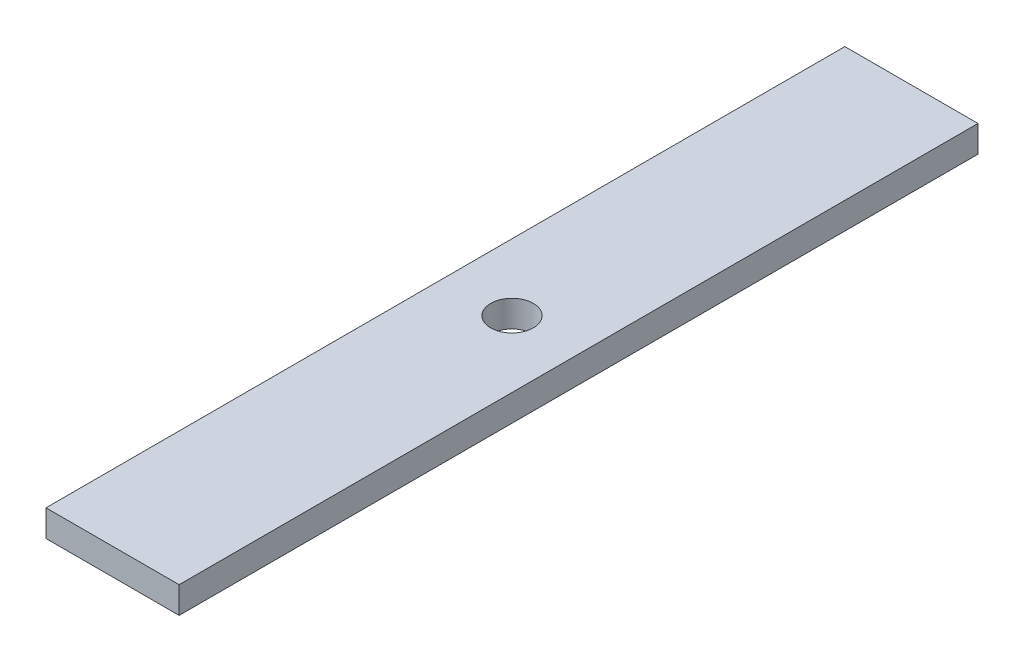
ISO-10303-21;
HEADER;
FILE_DESCRIPTION(('STEP AP214'),'2;1');
FILE_NAME('part.step','',(''),(''),'','','');
FILE_SCHEMA(('AUTOMOTIVE_DESIGN { 1 0 10303 214 1 1 1 1 }'));
ENDSEC;
DATA;
#1=APPLICATION_CONTEXT('core data for automotive mechanical design processes');
#2=APPLICATION_PROTOCOL_DEFINITION('international standard','automotive_design',2000,#1);
#3=PRODUCT_CONTEXT('',#1,'mechanical');
#4=PRODUCT('Part','Part','',(#3));
#5=PRODUCT_RELATED_PRODUCT_CATEGORY('part','',(#4));
#6=PRODUCT_DEFINITION_FORMATION('','',#4);
#7=PRODUCT_DEFINITION_CONTEXT('part definition',#1,'design');
#8=PRODUCT_DEFINITION('design','',#6,#7);
#9=PRODUCT_DEFINITION_SHAPE('','',#8);
#10=(LENGTH_UNIT() NAMED_UNIT(*) SI_UNIT(.MILLI.,.METRE.));
#11=(NAMED_UNIT(*) PLANE_ANGLE_UNIT() SI_UNIT($,.RADIAN.));
#12=(NAMED_UNIT(*) SI_UNIT($,.STERADIAN.) SOLID_ANGLE_UNIT());
#13=UNCERTAINTY_MEASURE_WITH_UNIT(LENGTH_MEASURE(1.E-05),#10,'distance_accuracy_value','');
#14=(GEOMETRIC_REPRESENTATION_CONTEXT(3) GLOBAL_UNCERTAINTY_ASSIGNED_CONTEXT((#13)) GLOBAL_UNIT_ASSIGNED_CONTEXT((#10,
#11,#12)) REPRESENTATION_CONTEXT('',''));
#15=CARTESIAN_POINT('',(0.,0.,0.));
#16=DIRECTION('',(0.,0.,1.));
#17=DIRECTION('',(1.,0.,0.));
#18=AXIS2_PLACEMENT_3D('',#15,#16,#17);
#19=CARTESIAN_POINT('',(-12.5,2.5,106.));
#20=DIRECTION('',(1.,0.,0.));
#21=DIRECTION('',(0.,0.,-1.));
#22=AXIS2_PLACEMENT_3D('',#19,#20,#21);
#23=PLANE('',#22);
#24=DIRECTION('',(0.,-1.,0.));
#25=VECTOR('',#24,1.);
#26=CARTESIAN_POINT('',(-12.5,2.5,75.));
#27=LINE('',#26,#25);
#28=CARTESIAN_POINT('',(-12.5,2.5,75.));
#29=VERTEX_POINT('',#28);
#30=CARTESIAN_POINT('',(-12.5,-2.5,75.));
#31=VERTEX_POINT('',#30);
#32=EDGE_CURVE('E74',#29,#31,#27,.T.);
#33=ORIENTED_EDGE('',*,*,#32,.F.);
#34=DIRECTION('',(0.,0.,-1.));
#35=VECTOR('',#34,1.);
#36=CARTESIAN_POINT('',(-12.5,2.5,106.));
#37=LINE('',#36,#35);
#38=CARTESIAN_POINT('',(-12.5,2.5,-75.));
#39=VERTEX_POINT('',#38);
#40=EDGE_CURVE('E86',#29,#39,#37,.T.);
#41=ORIENTED_EDGE('',*,*,#40,.T.);
#42=DIRECTION('',(0.,1.,0.));
#43=VECTOR('',#42,1.);
#44=CARTESIAN_POINT('',(-12.5,2.5,-75.));
#45=LINE('',#44,#43);
#46=CARTESIAN_POINT('',(-12.5,-2.5,-75.));
#47=VERTEX_POINT('',#46);
#48=EDGE_CURVE('E56',#47,#39,#45,.T.);
#49=ORIENTED_EDGE('',*,*,#48,.F.);
#50=DIRECTION('',(0.,0.,-1.));
#51=VECTOR('',#50,1.);
#52=CARTESIAN_POINT('',(-12.5,-2.5,106.));
#53=LINE('',#52,#51);
#54=EDGE_CURVE('E12',#31,#47,#53,.T.);
#55=ORIENTED_EDGE('',*,*,#54,.F.);
#56=EDGE_LOOP('',(#33,#41,#49,#55));
#57=FACE_BOUND('',#56,.T.);
#58=ADVANCED_FACE('F34',(#57),#23,.F.);
#59=CARTESIAN_POINT('',(-12.5,-2.5,106.));
#60=DIRECTION('',(0.,1.,0.));
#61=DIRECTION('',(-1.,0.,0.));
#62=AXIS2_PLACEMENT_3D('',#59,#60,#61);
#63=PLANE('',#62);
#64=CARTESIAN_POINT('',(0.,-2.5,0.));
#65=DIRECTION('',(0.,1.,0.));
#66=DIRECTION('',(-1.,0.,0.));
#67=AXIS2_PLACEMENT_3D('',#64,#65,#66);
#68=CIRCLE('',#67,4.);
#69=CARTESIAN_POINT('',(-4.,-2.5,0.));
#70=VERTEX_POINT('',#69);
#71=EDGE_CURVE('E91',#70,#70,#68,.T.);
#72=ORIENTED_EDGE('',*,*,#71,.T.);
#73=EDGE_LOOP('',(#72));
#74=FACE_BOUND('',#73,.T.);
#75=DIRECTION('',(1.,0.,0.));
#76=VECTOR('',#75,1.);
#77=CARTESIAN_POINT('',(-25.7525042215434,-2.5,75.));
#78=LINE('',#77,#76);
#79=CARTESIAN_POINT('',(12.5,-2.5,75.));
#80=VERTEX_POINT('',#79);
#81=EDGE_CURVE('E106',#31,#80,#78,.T.);
#82=ORIENTED_EDGE('',*,*,#81,.F.);
#83=ORIENTED_EDGE('',*,*,#54,.T.);
#84=DIRECTION('',(-1.,0.,0.));
#85=VECTOR('',#84,1.);
#86=CARTESIAN_POINT('',(-25.7525042215434,-2.5,-75.));
#87=LINE('',#86,#85);
#88=CARTESIAN_POINT('',(12.5,-2.5,-75.));
#89=VERTEX_POINT('',#88);
#90=EDGE_CURVE('E80',#89,#47,#87,.T.);
#91=ORIENTED_EDGE('',*,*,#90,.F.);
#92=DIRECTION('',(0.,0.,-1.));
#93=VECTOR('',#92,1.);
#94=CARTESIAN_POINT('',(12.5,-2.5,106.));
#95=LINE('',#94,#93);
#96=EDGE_CURVE('E41',#80,#89,#95,.T.);
#97=ORIENTED_EDGE('',*,*,#96,.F.);
#98=EDGE_LOOP('',(#82,#83,#91,#97));
#99=FACE_BOUND('',#98,.T.);
#100=ADVANCED_FACE('F105',(#74,#99),#63,.F.);
#101=CARTESIAN_POINT('',(12.5,2.5,106.));
#102=DIRECTION('',(-1.,0.,0.));
#103=DIRECTION('',(0.,0.,1.));
#104=AXIS2_PLACEMENT_3D('',#101,#102,#103);
#105=PLANE('',#104);
#106=DIRECTION('',(0.,1.,0.));
#107=VECTOR('',#106,1.);
#108=CARTESIAN_POINT('',(12.5,2.5,75.));
#109=LINE('',#108,#107);
#110=CARTESIAN_POINT('',(12.5,2.5,75.));
#111=VERTEX_POINT('',#110);
#112=EDGE_CURVE('E48',#80,#111,#109,.T.);
#113=ORIENTED_EDGE('',*,*,#112,.F.);
#114=ORIENTED_EDGE('',*,*,#96,.T.);
#115=DIRECTION('',(0.,-1.,0.));
#116=VECTOR('',#115,1.);
#117=CARTESIAN_POINT('',(12.5,2.5,-75.));
#118=LINE('',#117,#116);
#119=CARTESIAN_POINT('',(12.5,2.5,-75.));
#120=VERTEX_POINT('',#119);
#121=EDGE_CURVE('E102',#120,#89,#118,.T.);
#122=ORIENTED_EDGE('',*,*,#121,.F.);
#123=DIRECTION('',(0.,0.,-1.));
#124=VECTOR('',#123,1.);
#125=CARTESIAN_POINT('',(12.5,2.5,106.));
#126=LINE('',#125,#124);
#127=EDGE_CURVE('E90',#111,#120,#126,.T.);
#128=ORIENTED_EDGE('',*,*,#127,.F.);
#129=EDGE_LOOP('',(#113,#114,#122,#128));
#130=FACE_BOUND('',#129,.T.);
#131=ADVANCED_FACE('F101',(#130),#105,.F.);
#132=CARTESIAN_POINT('',(-12.5,2.5,106.));
#133=DIRECTION('',(0.,-1.,0.));
#134=DIRECTION('',(1.,0.,0.));
#135=AXIS2_PLACEMENT_3D('',#132,#133,#134);
#136=PLANE('',#135);
#137=CARTESIAN_POINT('',(0.,2.5,0.));
#138=DIRECTION('',(0.,1.,0.));
#139=DIRECTION('',(-1.,0.,0.));
#140=AXIS2_PLACEMENT_3D('',#137,#138,#139);
#141=CIRCLE('',#140,4.);
#142=CARTESIAN_POINT('',(-4.,2.5,0.));
#143=VERTEX_POINT('',#142);
#144=EDGE_CURVE('E87',#143,#143,#141,.T.);
#145=ORIENTED_EDGE('',*,*,#144,.F.);
#146=EDGE_LOOP('',(#145));
#147=FACE_BOUND('',#146,.T.);
#148=DIRECTION('',(1.,0.,0.));
#149=VECTOR('',#148,1.);
#150=CARTESIAN_POINT('',(-25.7525042215434,2.5,75.));
#151=LINE('',#150,#149);
#152=EDGE_CURVE('E71',#29,#111,#151,.T.);
#153=ORIENTED_EDGE('',*,*,#152,.T.);
#154=ORIENTED_EDGE('',*,*,#127,.T.);
#155=DIRECTION('',(-1.,0.,0.));
#156=VECTOR('',#155,1.);
#157=CARTESIAN_POINT('',(-25.7525042215434,2.5,-75.));
#158=LINE('',#157,#156);
#159=EDGE_CURVE('E81',#120,#39,#158,.T.);
#160=ORIENTED_EDGE('',*,*,#159,.T.);
#161=ORIENTED_EDGE('',*,*,#40,.F.);
#162=EDGE_LOOP('',(#153,#154,#160,#161));
#163=FACE_BOUND('',#162,.T.);
#164=ADVANCED_FACE('F89',(#147,#163),#136,.F.);
#165=CARTESIAN_POINT('',(0.,-2.5,0.));
#166=DIRECTION('',(0.,1.,0.));
#167=DIRECTION('',(-1.,0.,0.));
#168=AXIS2_PLACEMENT_3D('',#165,#166,#167);
#169=CYLINDRICAL_SURFACE('',#168,4.);
#170=CARTESIAN_POINT('',(-4.,-2.5,0.));
#171=CARTESIAN_POINT('',(-4.,-2.44791666666667,0.));
#172=CARTESIAN_POINT('',(-4.,-2.39583333333333,0.));
#173=CARTESIAN_POINT('',(-4.,-2.29166666666667,0.));
#174=CARTESIAN_POINT('',(-4.,-2.23958333333333,0.));
#175=CARTESIAN_POINT('',(-4.,-2.13541666666667,0.));
#176=CARTESIAN_POINT('',(-4.,-2.08333333333333,0.));
#177=CARTESIAN_POINT('',(-4.,-1.97916666666667,0.));
#178=CARTESIAN_POINT('',(-4.,-1.92708333333333,0.));
#179=CARTESIAN_POINT('',(-4.,-1.82291666666667,0.));
#180=CARTESIAN_POINT('',(-4.,-1.77083333333333,0.));
#181=CARTESIAN_POINT('',(-4.,-1.66666666666667,0.));
#182=CARTESIAN_POINT('',(-4.,-1.61458333333333,0.));
#183=CARTESIAN_POINT('',(-4.,-1.51041666666667,0.));
#184=CARTESIAN_POINT('',(-4.,-1.45833333333333,0.));
#185=CARTESIAN_POINT('',(-4.,-1.35416666666667,0.));
#186=CARTESIAN_POINT('',(-4.,-1.30208333333333,0.));
#187=CARTESIAN_POINT('',(-4.,-1.19791666666667,0.));
#188=CARTESIAN_POINT('',(-4.,-1.14583333333333,0.));
#189=CARTESIAN_POINT('',(-4.,-1.04166666666667,0.));
#190=CARTESIAN_POINT('',(-4.,-0.989583333333334,0.));
#191=CARTESIAN_POINT('',(-4.,-0.885416666666667,0.));
#192=CARTESIAN_POINT('',(-4.,-0.833333333333334,0.));
#193=CARTESIAN_POINT('',(-4.,-0.729166666666667,0.));
#194=CARTESIAN_POINT('',(-4.,-0.677083333333334,0.));
#195=CARTESIAN_POINT('',(-4.,-0.572916666666667,0.));
#196=CARTESIAN_POINT('',(-4.,-0.520833333333334,0.));
#197=CARTESIAN_POINT('',(-4.,-0.416666666666667,0.));
#198=CARTESIAN_POINT('',(-4.,-0.364583333333334,0.));
#199=CARTESIAN_POINT('',(-4.,-0.260416666666667,0.));
#200=CARTESIAN_POINT('',(-4.,-0.208333333333334,0.));
#201=CARTESIAN_POINT('',(-4.,-0.104166666666667,0.));
#202=CARTESIAN_POINT('',(-4.,-0.0520833333333334,0.));
#203=CARTESIAN_POINT('',(-4.,0.0520833333333334,0.));
#204=CARTESIAN_POINT('',(-4.,0.104166666666667,0.));
#205=CARTESIAN_POINT('',(-4.,0.208333333333334,0.));
#206=CARTESIAN_POINT('',(-4.,0.260416666666667,0.));
#207=CARTESIAN_POINT('',(-4.,0.364583333333334,0.));
#208=CARTESIAN_POINT('',(-4.,0.416666666666667,0.));
#209=CARTESIAN_POINT('',(-4.,0.520833333333334,0.));
#210=CARTESIAN_POINT('',(-4.,0.572916666666667,0.));
#211=CARTESIAN_POINT('',(-4.,0.677083333333334,0.));
#212=CARTESIAN_POINT('',(-4.,0.729166666666667,0.));
#213=CARTESIAN_POINT('',(-4.,0.833333333333334,0.));
#214=CARTESIAN_POINT('',(-4.,0.885416666666667,0.));
#215=CARTESIAN_POINT('',(-4.,0.989583333333334,0.));
#216=CARTESIAN_POINT('',(-4.,1.04166666666667,0.));
#217=CARTESIAN_POINT('',(-4.,1.14583333333333,0.));
#218=CARTESIAN_POINT('',(-4.,1.19791666666667,0.));
#219=CARTESIAN_POINT('',(-4.,1.30208333333333,0.));
#220=CARTESIAN_POINT('',(-4.,1.35416666666667,0.));
#221=CARTESIAN_POINT('',(-4.,1.45833333333333,0.));
#222=CARTESIAN_POINT('',(-4.,1.51041666666667,0.));
#223=CARTESIAN_POINT('',(-4.,1.61458333333333,0.));
#224=CARTESIAN_POINT('',(-4.,1.66666666666667,0.));
#225=CARTESIAN_POINT('',(-4.,1.77083333333333,0.));
#226=CARTESIAN_POINT('',(-4.,1.82291666666667,0.));
#227=CARTESIAN_POINT('',(-4.,1.92708333333333,0.));
#228=CARTESIAN_POINT('',(-4.,1.97916666666667,0.));
#229=CARTESIAN_POINT('',(-4.,2.08333333333333,0.));
#230=CARTESIAN_POINT('',(-4.,2.13541666666667,0.));
#231=CARTESIAN_POINT('',(-4.,2.23958333333333,0.));
#232=CARTESIAN_POINT('',(-4.,2.29166666666667,0.));
#233=CARTESIAN_POINT('',(-4.,2.39583333333333,0.));
#234=CARTESIAN_POINT('',(-4.,2.44791666666667,0.));
#235=CARTESIAN_POINT('',(-4.,2.5,0.));
#236=B_SPLINE_CURVE_WITH_KNOTS('',3,(#170,#171,#172,#173,#174,#175,#176,#177,#178,#179,#180,
#181,#182,#183,#184,#185,#186,#187,#188,#189,#190,#191,#192,#193,#194,#195,#196,#197,#198,#199,
#200,#201,#202,#203,#204,#205,#206,#207,#208,#209,#210,#211,#212,#213,#214,#215,#216,#217,#218,
#219,#220,#221,#222,#223,#224,#225,#226,#227,#228,#229,#230,#231,#232,#233,#234,#235),
.UNSPECIFIED.,.F.,.F.,(4,2,2,2,2,2,2,2,2,2,2,2,2,2,2,2,2,2,2,2,2,2,2,2,2,2,2,2,2,2,2,2,4),(0.,
0.15625,0.3125,0.46875,0.625,0.78125,0.9375,1.09375,1.25,1.40625,1.5625,1.71875,1.875,2.03125,
2.1875,2.34375,2.5,2.65625,2.8125,2.96875,3.125,3.28125,3.4375,3.59375,3.75,3.90625,4.0625,
4.21875,4.375,4.53125,4.6875,4.84375,5.),.UNSPECIFIED.);
#237=EDGE_CURVE('BSEAM115',#70,#143,#236,.T.);
#238=ORIENTED_EDGE('',*,*,#71,.F.);
#239=ORIENTED_EDGE('',*,*,#144,.T.);
#240=ORIENTED_EDGE('',*,*,#237,.T.);
#241=ORIENTED_EDGE('',*,*,#237,.F.);
#242=EDGE_LOOP('',(#238,#240,#239,#241));
#243=FACE_BOUND('',#242,.T.);
#244=ADVANCED_FACE('F115',(#243),#169,.F.);
#245=CARTESIAN_POINT('',(-25.7525042215434,-2.5,-75.));
#246=DIRECTION('',(0.,0.,-1.));
#247=DIRECTION('',(-1.,0.,0.));
#248=AXIS2_PLACEMENT_3D('',#245,#246,#247);
#249=PLANE('',#248);
#250=ORIENTED_EDGE('',*,*,#48,.T.);
#251=ORIENTED_EDGE('',*,*,#159,.F.);
#252=ORIENTED_EDGE('',*,*,#121,.T.);
#253=ORIENTED_EDGE('',*,*,#90,.T.);
#254=EDGE_LOOP('',(#250,#251,#252,#253));
#255=FACE_BOUND('',#254,.T.);
#256=ADVANCED_FACE('F113',(#255),#249,.T.);
#257=CARTESIAN_POINT('',(-25.7525042215434,-2.5,75.));
#258=DIRECTION('',(0.,0.,1.));
#259=DIRECTION('',(1.,0.,0.));
#260=AXIS2_PLACEMENT_3D('',#257,#258,#259);
#261=PLANE('',#260);
#262=ORIENTED_EDGE('',*,*,#32,.T.);
#263=ORIENTED_EDGE('',*,*,#81,.T.);
#264=ORIENTED_EDGE('',*,*,#112,.T.);
#265=ORIENTED_EDGE('',*,*,#152,.F.);
#266=EDGE_LOOP('',(#262,#263,#264,#265));
#267=FACE_BOUND('',#266,.T.);
#268=ADVANCED_FACE('F73',(#267),#261,.T.);
#269=CLOSED_SHELL('',(#58,#100,#131,#164,#244,#256,#268));
#270=MANIFOLD_SOLID_BREP('B2',#269);
#271=ADVANCED_BREP_SHAPE_REPRESENTATION('',(#18,#270),#14);
#272=SHAPE_DEFINITION_REPRESENTATION(#9,#271);
ENDSEC;
END-ISO-10303-21;
